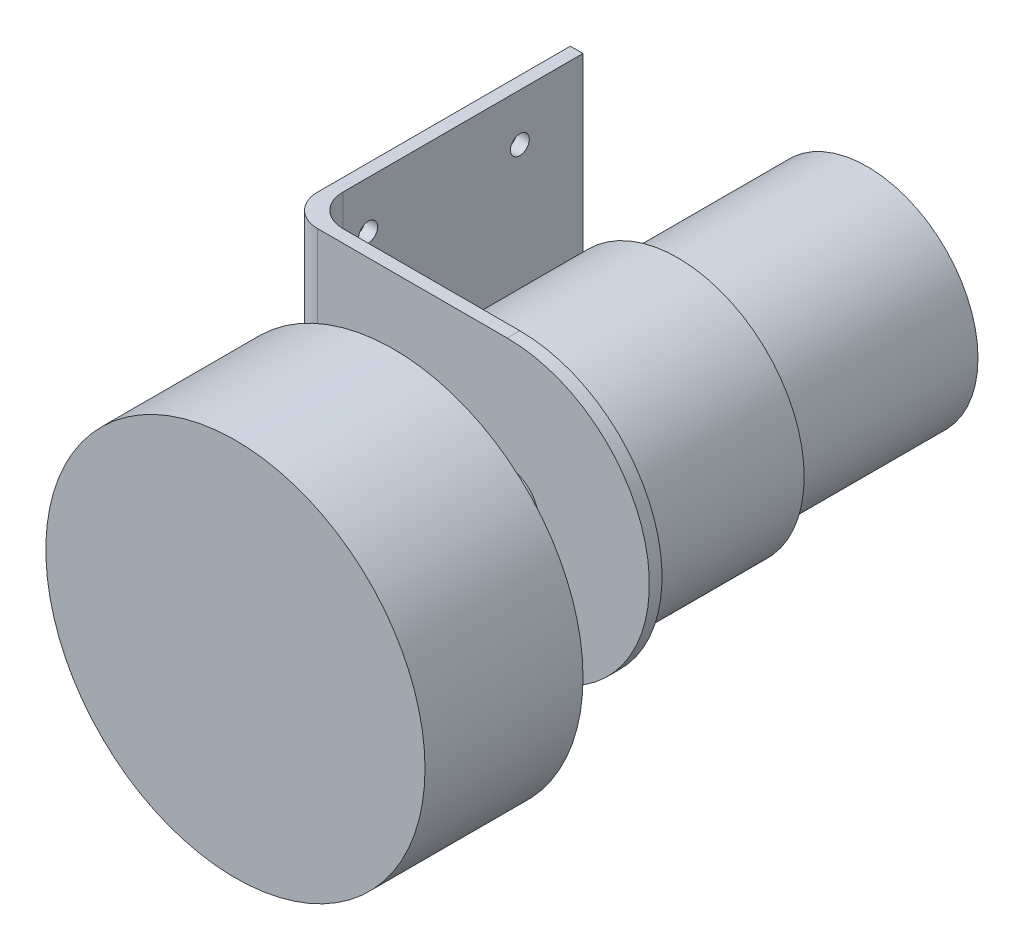
ISO-10303-21;
HEADER;
FILE_DESCRIPTION(('STEP AP214'),'2;1');
FILE_NAME('part.step','',(''),(''),'','','');
FILE_SCHEMA(('AUTOMOTIVE_DESIGN { 1 0 10303 214 1 1 1 1 }'));
ENDSEC;
DATA;
#1=APPLICATION_CONTEXT('core data for automotive mechanical design processes');
#2=APPLICATION_PROTOCOL_DEFINITION('international standard','automotive_design',2000,#1);
#3=PRODUCT_CONTEXT('',#1,'mechanical');
#4=PRODUCT('Part','Part','',(#3));
#5=PRODUCT_RELATED_PRODUCT_CATEGORY('part','',(#4));
#6=PRODUCT_DEFINITION_FORMATION('','',#4);
#7=PRODUCT_DEFINITION_CONTEXT('part definition',#1,'design');
#8=PRODUCT_DEFINITION('design','',#6,#7);
#9=PRODUCT_DEFINITION_SHAPE('','',#8);
#10=(LENGTH_UNIT() NAMED_UNIT(*) SI_UNIT(.MILLI.,.METRE.));
#11=(NAMED_UNIT(*) PLANE_ANGLE_UNIT() SI_UNIT($,.RADIAN.));
#12=(NAMED_UNIT(*) SI_UNIT($,.STERADIAN.) SOLID_ANGLE_UNIT());
#13=UNCERTAINTY_MEASURE_WITH_UNIT(LENGTH_MEASURE(1.E-05),#10,'distance_accuracy_value','');
#14=(GEOMETRIC_REPRESENTATION_CONTEXT(3) GLOBAL_UNCERTAINTY_ASSIGNED_CONTEXT((#13)) GLOBAL_UNIT_ASSIGNED_CONTEXT((#10,
#11,#12)) REPRESENTATION_CONTEXT('',''));
#15=CARTESIAN_POINT('',(0.,0.,0.));
#16=DIRECTION('',(0.,0.,1.));
#17=DIRECTION('',(1.,0.,0.));
#18=AXIS2_PLACEMENT_3D('',#15,#16,#17);
#19=CARTESIAN_POINT('',(0.,0.,100.));
#20=DIRECTION('',(0.,0.,-1.));
#21=DIRECTION('',(-1.,0.,0.));
#22=AXIS2_PLACEMENT_3D('',#19,#20,#21);
#23=CYLINDRICAL_SURFACE('',#22,5.);
#24=CARTESIAN_POINT('',(0.,0.,57.));
#25=DIRECTION('',(0.,0.,1.));
#26=DIRECTION('',(1.,0.,0.));
#27=AXIS2_PLACEMENT_3D('',#24,#25,#26);
#28=CIRCLE('',#27,5.);
#29=CARTESIAN_POINT('',(5.,0.,57.));
#30=VERTEX_POINT('',#29);
#31=EDGE_CURVE('E174',#30,#30,#28,.F.);
#32=ORIENTED_EDGE('',*,*,#31,.F.);
#33=EDGE_LOOP('',(#32));
#34=FACE_BOUND('',#33,.T.);
#35=CARTESIAN_POINT('',(0.,0.,75.));
#36=DIRECTION('',(0.,0.,1.));
#37=DIRECTION('',(1.,0.,0.));
#38=AXIS2_PLACEMENT_3D('',#35,#36,#37);
#39=CIRCLE('',#38,5.);
#40=CARTESIAN_POINT('',(5.,0.,75.));
#41=VERTEX_POINT('',#40);
#42=EDGE_CURVE('E161',#41,#41,#39,.F.);
#43=ORIENTED_EDGE('',*,*,#42,.T.);
#44=EDGE_LOOP('',(#43));
#45=FACE_BOUND('',#44,.T.);
#46=ADVANCED_FACE('F35',(#34,#45),#23,.T.);
#47=CARTESIAN_POINT('',(0.,0.,75.));
#48=DIRECTION('',(0.,0.,1.));
#49=DIRECTION('',(1.,0.,0.));
#50=AXIS2_PLACEMENT_3D('',#47,#48,#49);
#51=CYLINDRICAL_SURFACE('',#50,30.);
#52=CARTESIAN_POINT('',(0.,0.,75.));
#53=DIRECTION('',(0.,0.,1.));
#54=DIRECTION('',(1.,0.,0.));
#55=AXIS2_PLACEMENT_3D('',#52,#53,#54);
#56=CIRCLE('',#55,30.);
#57=CARTESIAN_POINT('',(30.,0.,75.));
#58=VERTEX_POINT('',#57);
#59=EDGE_CURVE('E158',#58,#58,#56,.T.);
#60=ORIENTED_EDGE('',*,*,#59,.T.);
#61=EDGE_LOOP('',(#60));
#62=FACE_BOUND('',#61,.T.);
#63=CARTESIAN_POINT('',(0.,0.,100.));
#64=DIRECTION('',(0.,0.,1.));
#65=DIRECTION('',(1.,0.,0.));
#66=AXIS2_PLACEMENT_3D('',#63,#64,#65);
#67=CIRCLE('',#66,30.);
#68=CARTESIAN_POINT('',(30.,0.,100.));
#69=VERTEX_POINT('',#68);
#70=EDGE_CURVE('E157',#69,#69,#67,.T.);
#71=ORIENTED_EDGE('',*,*,#70,.F.);
#72=EDGE_LOOP('',(#71));
#73=FACE_BOUND('',#72,.T.);
#74=ADVANCED_FACE('F225',(#62,#73),#51,.T.);
#75=CARTESIAN_POINT('',(0.,0.,75.));
#76=DIRECTION('',(0.,0.,1.));
#77=DIRECTION('',(1.,0.,0.));
#78=AXIS2_PLACEMENT_3D('',#75,#76,#77);
#79=PLANE('',#78);
#80=ORIENTED_EDGE('',*,*,#42,.F.);
#81=EDGE_LOOP('',(#80));
#82=FACE_BOUND('',#81,.T.);
#83=ORIENTED_EDGE('',*,*,#59,.F.);
#84=EDGE_LOOP('',(#83));
#85=FACE_BOUND('',#84,.T.);
#86=ADVANCED_FACE('F231',(#82,#85),#79,.F.);
#87=CARTESIAN_POINT('',(0.,0.,100.));
#88=DIRECTION('',(0.,0.,-1.));
#89=DIRECTION('',(-1.,0.,0.));
#90=AXIS2_PLACEMENT_3D('',#87,#88,#89);
#91=PLANE('',#90);
#92=ORIENTED_EDGE('',*,*,#70,.T.);
#93=EDGE_LOOP('',(#92));
#94=FACE_BOUND('',#93,.T.);
#95=ADVANCED_FACE('F238',(#94),#91,.F.);
#96=CARTESIAN_POINT('',(0.,0.,57.));
#97=DIRECTION('',(0.,0.,-1.));
#98=DIRECTION('',(-1.,0.,0.));
#99=AXIS2_PLACEMENT_3D('',#96,#97,#98);
#100=CYLINDRICAL_SURFACE('',#99,22.5);
#101=CARTESIAN_POINT('',(0.,0.,55.));
#102=DIRECTION('',(0.,0.,1.));
#103=DIRECTION('',(1.,0.,0.));
#104=AXIS2_PLACEMENT_3D('',#101,#102,#103);
#105=CIRCLE('',#104,22.5);
#106=CARTESIAN_POINT('',(0.,-22.5,55.));
#107=VERTEX_POINT('',#106);
#108=CARTESIAN_POINT('',(0.,22.5,55.));
#109=VERTEX_POINT('',#108);
#110=EDGE_CURVE('E134',#107,#109,#105,.T.);
#111=ORIENTED_EDGE('',*,*,#110,.T.);
#112=DIRECTION('',(0.,0.,-1.));
#113=VECTOR('',#112,1.);
#114=CARTESIAN_POINT('',(0.,22.5,57.));
#115=LINE('',#114,#113);
#116=CARTESIAN_POINT('',(0.,22.5,57.));
#117=VERTEX_POINT('',#116);
#118=EDGE_CURVE('E154',#117,#109,#115,.T.);
#119=ORIENTED_EDGE('',*,*,#118,.F.);
#120=CARTESIAN_POINT('',(0.,0.,57.));
#121=DIRECTION('',(0.,0.,1.));
#122=DIRECTION('',(1.,0.,0.));
#123=AXIS2_PLACEMENT_3D('',#120,#121,#122);
#124=CIRCLE('',#123,22.5);
#125=CARTESIAN_POINT('',(0.,-22.5,57.));
#126=VERTEX_POINT('',#125);
#127=EDGE_CURVE('E136',#126,#117,#124,.T.);
#128=ORIENTED_EDGE('',*,*,#127,.F.);
#129=DIRECTION('',(0.,0.,-1.));
#130=VECTOR('',#129,1.);
#131=CARTESIAN_POINT('',(0.,-22.5,57.));
#132=LINE('',#131,#130);
#133=EDGE_CURVE('E106',#126,#107,#132,.T.);
#134=ORIENTED_EDGE('',*,*,#133,.T.);
#135=EDGE_LOOP('',(#111,#119,#128,#134));
#136=FACE_BOUND('',#135,.T.);
#137=ADVANCED_FACE('F219',(#136),#100,.T.);
#138=CARTESIAN_POINT('',(0.,22.5,57.));
#139=DIRECTION('',(0.,-1.,0.));
#140=DIRECTION('',(0.,0.,-1.));
#141=AXIS2_PLACEMENT_3D('',#138,#139,#140);
#142=PLANE('',#141);
#143=DIRECTION('',(0.,0.,-1.));
#144=VECTOR('',#143,1.);
#145=CARTESIAN_POINT('',(-35.,22.5,57.));
#146=LINE('',#145,#144);
#147=CARTESIAN_POINT('',(-35.,22.5,52.));
#148=VERTEX_POINT('',#147);
#149=CARTESIAN_POINT('',(-35.,22.5,12.));
#150=VERTEX_POINT('',#149);
#151=EDGE_CURVE('E105',#148,#150,#146,.T.);
#152=ORIENTED_EDGE('',*,*,#151,.F.);
#153=CARTESIAN_POINT('',(-30.,22.5,52.));
#154=DIRECTION('',(0.,-1.,0.));
#155=DIRECTION('',(0.,0.,-1.));
#156=AXIS2_PLACEMENT_3D('',#153,#154,#155);
#157=CIRCLE('',#156,5.);
#158=CARTESIAN_POINT('',(-30.,22.5,57.));
#159=VERTEX_POINT('',#158);
#160=EDGE_CURVE('E191',#148,#159,#157,.F.);
#161=ORIENTED_EDGE('',*,*,#160,.T.);
#162=DIRECTION('',(-1.,0.,0.));
#163=VECTOR('',#162,1.);
#164=CARTESIAN_POINT('',(0.,22.5,57.));
#165=LINE('',#164,#163);
#166=EDGE_CURVE('E139',#117,#159,#165,.T.);
#167=ORIENTED_EDGE('',*,*,#166,.F.);
#168=ORIENTED_EDGE('',*,*,#118,.T.);
#169=DIRECTION('',(-1.,0.,0.));
#170=VECTOR('',#169,1.);
#171=CARTESIAN_POINT('',(0.,22.5,55.));
#172=LINE('',#171,#170);
#173=CARTESIAN_POINT('',(-28.,22.5,55.));
#174=VERTEX_POINT('',#173);
#175=EDGE_CURVE('E147',#109,#174,#172,.T.);
#176=ORIENTED_EDGE('',*,*,#175,.T.);
#177=CARTESIAN_POINT('',(-28.,22.5,50.));
#178=DIRECTION('',(0.,-1.,0.));
#179=DIRECTION('',(0.,0.,-1.));
#180=AXIS2_PLACEMENT_3D('',#177,#178,#179);
#181=CIRCLE('',#180,5.);
#182=CARTESIAN_POINT('',(-33.,22.5,50.));
#183=VERTEX_POINT('',#182);
#184=EDGE_CURVE('E44',#174,#183,#181,.T.);
#185=ORIENTED_EDGE('',*,*,#184,.T.);
#186=DIRECTION('',(0.,0.,1.));
#187=VECTOR('',#186,1.);
#188=CARTESIAN_POINT('',(-33.,22.5,12.));
#189=LINE('',#188,#187);
#190=CARTESIAN_POINT('',(-33.,22.5,12.));
#191=VERTEX_POINT('',#190);
#192=EDGE_CURVE('E131',#191,#183,#189,.T.);
#193=ORIENTED_EDGE('',*,*,#192,.F.);
#194=DIRECTION('',(-1.,0.,0.));
#195=VECTOR('',#194,1.);
#196=CARTESIAN_POINT('',(-35.,22.5,12.));
#197=LINE('',#196,#195);
#198=EDGE_CURVE('E128',#191,#150,#197,.T.);
#199=ORIENTED_EDGE('',*,*,#198,.T.);
#200=EDGE_LOOP('',(#152,#161,#167,#168,#176,#185,#193,#199));
#201=FACE_BOUND('',#200,.T.);
#202=ADVANCED_FACE('F210',(#201),#142,.F.);
#203=CARTESIAN_POINT('',(-35.,22.5,57.));
#204=DIRECTION('',(1.,0.,0.));
#205=DIRECTION('',(0.,0.,-1.));
#206=AXIS2_PLACEMENT_3D('',#203,#204,#205);
#207=PLANE('',#206);
#208=CARTESIAN_POINT('',(-35.,-15.,22.));
#209=DIRECTION('',(-1.,0.,0.));
#210=DIRECTION('',(0.,0.,-1.));
#211=AXIS2_PLACEMENT_3D('',#208,#209,#210);
#212=CIRCLE('',#211,1.5);
#213=CARTESIAN_POINT('',(-35.,-15.,23.5));
#214=VERTEX_POINT('',#213);
#215=EDGE_CURVE('E197',#214,#214,#212,.T.);
#216=ORIENTED_EDGE('',*,*,#215,.F.);
#217=EDGE_LOOP('',(#216));
#218=FACE_BOUND('',#217,.T.);
#219=CARTESIAN_POINT('',(-35.,15.,46.));
#220=DIRECTION('',(-1.,0.,0.));
#221=DIRECTION('',(0.,0.,1.));
#222=AXIS2_PLACEMENT_3D('',#219,#220,#221);
#223=CIRCLE('',#222,1.5);
#224=CARTESIAN_POINT('',(-35.,15.,47.5));
#225=VERTEX_POINT('',#224);
#226=EDGE_CURVE('E440',#225,#225,#223,.T.);
#227=ORIENTED_EDGE('',*,*,#226,.F.);
#228=EDGE_LOOP('',(#227));
#229=FACE_BOUND('',#228,.T.);
#230=CARTESIAN_POINT('',(-35.,-15.,46.));
#231=DIRECTION('',(-1.,0.,0.));
#232=DIRECTION('',(0.,0.,-1.));
#233=AXIS2_PLACEMENT_3D('',#230,#231,#232);
#234=CIRCLE('',#233,1.5);
#235=CARTESIAN_POINT('',(-35.,-15.,47.5));
#236=VERTEX_POINT('',#235);
#237=EDGE_CURVE('E443',#236,#236,#234,.T.);
#238=ORIENTED_EDGE('',*,*,#237,.F.);
#239=EDGE_LOOP('',(#238));
#240=FACE_BOUND('',#239,.T.);
#241=CARTESIAN_POINT('',(-35.,15.,22.));
#242=DIRECTION('',(-1.,0.,0.));
#243=DIRECTION('',(0.,0.,1.));
#244=AXIS2_PLACEMENT_3D('',#241,#242,#243);
#245=CIRCLE('',#244,1.5);
#246=CARTESIAN_POINT('',(-35.,15.,23.5));
#247=VERTEX_POINT('',#246);
#248=EDGE_CURVE('E122',#247,#247,#245,.T.);
#249=ORIENTED_EDGE('',*,*,#248,.F.);
#250=EDGE_LOOP('',(#249));
#251=FACE_BOUND('',#250,.T.);
#252=DIRECTION('',(0.,0.,-1.));
#253=VECTOR('',#252,1.);
#254=CARTESIAN_POINT('',(-35.,-22.5,57.));
#255=LINE('',#254,#253);
#256=CARTESIAN_POINT('',(-35.,-22.5,52.));
#257=VERTEX_POINT('',#256);
#258=CARTESIAN_POINT('',(-35.,-22.5,12.));
#259=VERTEX_POINT('',#258);
#260=EDGE_CURVE('E99',#257,#259,#255,.T.);
#261=ORIENTED_EDGE('',*,*,#260,.F.);
#262=DIRECTION('',(0.,-1.,0.));
#263=VECTOR('',#262,1.);
#264=CARTESIAN_POINT('',(-35.,22.5,52.));
#265=LINE('',#264,#263);
#266=EDGE_CURVE('E52',#257,#148,#265,.F.);
#267=ORIENTED_EDGE('',*,*,#266,.T.);
#268=ORIENTED_EDGE('',*,*,#151,.T.);
#269=DIRECTION('',(0.,-1.,0.));
#270=VECTOR('',#269,1.);
#271=CARTESIAN_POINT('',(-35.,-22.5,12.));
#272=LINE('',#271,#270);
#273=EDGE_CURVE('E113',#150,#259,#272,.T.);
#274=ORIENTED_EDGE('',*,*,#273,.T.);
#275=EDGE_LOOP('',(#261,#267,#268,#274));
#276=FACE_BOUND('',#275,.T.);
#277=ADVANCED_FACE('F118',(#218,#229,#240,#251,#276),#207,.F.);
#278=CARTESIAN_POINT('',(-35.,-22.5,57.));
#279=DIRECTION('',(0.,1.,0.));
#280=DIRECTION('',(0.,0.,1.));
#281=AXIS2_PLACEMENT_3D('',#278,#279,#280);
#282=PLANE('',#281);
#283=DIRECTION('',(1.,0.,0.));
#284=VECTOR('',#283,1.);
#285=CARTESIAN_POINT('',(-35.,-22.5,57.));
#286=LINE('',#285,#284);
#287=CARTESIAN_POINT('',(-30.,-22.5,57.));
#288=VERTEX_POINT('',#287);
#289=EDGE_CURVE('E143',#288,#126,#286,.T.);
#290=ORIENTED_EDGE('',*,*,#289,.F.);
#291=CARTESIAN_POINT('',(-30.,-22.5,52.));
#292=DIRECTION('',(0.,1.,0.));
#293=DIRECTION('',(0.,0.,1.));
#294=AXIS2_PLACEMENT_3D('',#291,#292,#293);
#295=CIRCLE('',#294,5.);
#296=EDGE_CURVE('E60',#288,#257,#295,.F.);
#297=ORIENTED_EDGE('',*,*,#296,.T.);
#298=ORIENTED_EDGE('',*,*,#260,.T.);
#299=DIRECTION('',(1.,0.,0.));
#300=VECTOR('',#299,1.);
#301=CARTESIAN_POINT('',(-33.,-22.5,12.));
#302=LINE('',#301,#300);
#303=CARTESIAN_POINT('',(-33.,-22.5,12.));
#304=VERTEX_POINT('',#303);
#305=EDGE_CURVE('E103',#259,#304,#302,.T.);
#306=ORIENTED_EDGE('',*,*,#305,.T.);
#307=DIRECTION('',(0.,0.,1.));
#308=VECTOR('',#307,1.);
#309=CARTESIAN_POINT('',(-33.,-22.5,12.));
#310=LINE('',#309,#308);
#311=CARTESIAN_POINT('',(-33.,-22.5,50.));
#312=VERTEX_POINT('',#311);
#313=EDGE_CURVE('E130',#304,#312,#310,.T.);
#314=ORIENTED_EDGE('',*,*,#313,.T.);
#315=CARTESIAN_POINT('',(-28.,-22.5,50.));
#316=DIRECTION('',(0.,1.,0.));
#317=DIRECTION('',(0.,0.,1.));
#318=AXIS2_PLACEMENT_3D('',#315,#316,#317);
#319=CIRCLE('',#318,5.);
#320=CARTESIAN_POINT('',(-28.,-22.5,55.));
#321=VERTEX_POINT('',#320);
#322=EDGE_CURVE('E11',#312,#321,#319,.T.);
#323=ORIENTED_EDGE('',*,*,#322,.T.);
#324=DIRECTION('',(1.,0.,0.));
#325=VECTOR('',#324,1.);
#326=CARTESIAN_POINT('',(-35.,-22.5,55.));
#327=LINE('',#326,#325);
#328=EDGE_CURVE('E140',#321,#107,#327,.T.);
#329=ORIENTED_EDGE('',*,*,#328,.T.);
#330=ORIENTED_EDGE('',*,*,#133,.F.);
#331=EDGE_LOOP('',(#290,#297,#298,#306,#314,#323,#329,#330));
#332=FACE_BOUND('',#331,.T.);
#333=ADVANCED_FACE('F101',(#332),#282,.F.);
#334=CARTESIAN_POINT('',(0.,0.,57.));
#335=DIRECTION('',(0.,0.,1.));
#336=DIRECTION('',(1.,0.,0.));
#337=AXIS2_PLACEMENT_3D('',#334,#335,#336);
#338=PLANE('',#337);
#339=ORIENTED_EDGE('',*,*,#166,.T.);
#340=DIRECTION('',(0.,-1.,0.));
#341=VECTOR('',#340,1.);
#342=CARTESIAN_POINT('',(-30.,-22.5,57.));
#343=LINE('',#342,#341);
#344=EDGE_CURVE('E186',#159,#288,#343,.T.);
#345=ORIENTED_EDGE('',*,*,#344,.T.);
#346=ORIENTED_EDGE('',*,*,#289,.T.);
#347=ORIENTED_EDGE('',*,*,#127,.T.);
#348=EDGE_LOOP('',(#339,#345,#346,#347));
#349=FACE_BOUND('',#348,.T.);
#350=ORIENTED_EDGE('',*,*,#31,.T.);
#351=EDGE_LOOP('',(#350));
#352=FACE_BOUND('',#351,.T.);
#353=ADVANCED_FACE('F217',(#349,#352),#338,.T.);
#354=CARTESIAN_POINT('',(0.,0.,55.));
#355=DIRECTION('',(0.,0.,1.));
#356=DIRECTION('',(1.,0.,0.));
#357=AXIS2_PLACEMENT_3D('',#354,#355,#356);
#358=PLANE('',#357);
#359=CARTESIAN_POINT('',(0.,0.,55.));
#360=DIRECTION('',(0.,0.,1.));
#361=DIRECTION('',(1.,0.,0.));
#362=AXIS2_PLACEMENT_3D('',#359,#360,#361);
#363=CIRCLE('',#362,20.);
#364=CARTESIAN_POINT('',(20.,0.,55.));
#365=VERTEX_POINT('',#364);
#366=EDGE_CURVE('E164',#365,#365,#363,.T.);
#367=ORIENTED_EDGE('',*,*,#366,.T.);
#368=EDGE_LOOP('',(#367));
#369=FACE_BOUND('',#368,.T.);
#370=ORIENTED_EDGE('',*,*,#328,.F.);
#371=DIRECTION('',(0.,1.,0.));
#372=VECTOR('',#371,1.);
#373=CARTESIAN_POINT('',(-28.,0.,55.));
#374=LINE('',#373,#372);
#375=EDGE_CURVE('E181',#321,#174,#374,.T.);
#376=ORIENTED_EDGE('',*,*,#375,.T.);
#377=ORIENTED_EDGE('',*,*,#175,.F.);
#378=ORIENTED_EDGE('',*,*,#110,.F.);
#379=EDGE_LOOP('',(#370,#376,#377,#378));
#380=FACE_BOUND('',#379,.T.);
#381=ADVANCED_FACE('F252',(#369,#380),#358,.F.);
#382=CARTESIAN_POINT('',(0.,0.,0.));
#383=DIRECTION('',(0.,0.,1.));
#384=DIRECTION('',(1.,0.,0.));
#385=AXIS2_PLACEMENT_3D('',#382,#383,#384);
#386=PLANE('',#385);
#387=CARTESIAN_POINT('',(0.,0.,0.));
#388=DIRECTION('',(0.,0.,1.));
#389=DIRECTION('',(1.,0.,0.));
#390=AXIS2_PLACEMENT_3D('',#387,#388,#389);
#391=CIRCLE('',#390,17.5);
#392=CARTESIAN_POINT('',(17.5,0.,0.));
#393=VERTEX_POINT('',#392);
#394=EDGE_CURVE('E167',#393,#393,#391,.T.);
#395=ORIENTED_EDGE('',*,*,#394,.F.);
#396=EDGE_LOOP('',(#395));
#397=FACE_BOUND('',#396,.T.);
#398=ADVANCED_FACE('F249',(#397),#386,.F.);
#399=CARTESIAN_POINT('',(0.,0.,30.));
#400=DIRECTION('',(0.,0.,-1.));
#401=DIRECTION('',(-1.,0.,0.));
#402=AXIS2_PLACEMENT_3D('',#399,#400,#401);
#403=CYLINDRICAL_SURFACE('',#402,17.5);
#404=CARTESIAN_POINT('',(0.,0.,30.));
#405=DIRECTION('',(0.,0.,1.));
#406=DIRECTION('',(1.,0.,0.));
#407=AXIS2_PLACEMENT_3D('',#404,#405,#406);
#408=CIRCLE('',#407,17.5);
#409=CARTESIAN_POINT('',(17.5,0.,30.));
#410=VERTEX_POINT('',#409);
#411=EDGE_CURVE('E171',#410,#410,#408,.T.);
#412=ORIENTED_EDGE('',*,*,#411,.F.);
#413=EDGE_LOOP('',(#412));
#414=FACE_BOUND('',#413,.T.);
#415=ORIENTED_EDGE('',*,*,#394,.T.);
#416=EDGE_LOOP('',(#415));
#417=FACE_BOUND('',#416,.T.);
#418=ADVANCED_FACE('F243',(#414,#417),#403,.T.);
#419=CARTESIAN_POINT('',(0.,0.,30.));
#420=DIRECTION('',(0.,0.,1.));
#421=DIRECTION('',(1.,0.,0.));
#422=AXIS2_PLACEMENT_3D('',#419,#420,#421);
#423=PLANE('',#422);
#424=ORIENTED_EDGE('',*,*,#411,.T.);
#425=EDGE_LOOP('',(#424));
#426=FACE_BOUND('',#425,.T.);
#427=CARTESIAN_POINT('',(0.,0.,30.));
#428=DIRECTION('',(0.,0.,1.));
#429=DIRECTION('',(1.,0.,0.));
#430=AXIS2_PLACEMENT_3D('',#427,#428,#429);
#431=CIRCLE('',#430,20.);
#432=CARTESIAN_POINT('',(20.,0.,30.));
#433=VERTEX_POINT('',#432);
#434=EDGE_CURVE('E168',#433,#433,#431,.T.);
#435=ORIENTED_EDGE('',*,*,#434,.F.);
#436=EDGE_LOOP('',(#435));
#437=FACE_BOUND('',#436,.T.);
#438=ADVANCED_FACE('F239',(#426,#437),#423,.F.);
#439=CARTESIAN_POINT('',(0.,0.,55.));
#440=DIRECTION('',(0.,0.,-1.));
#441=DIRECTION('',(-1.,0.,0.));
#442=AXIS2_PLACEMENT_3D('',#439,#440,#441);
#443=CYLINDRICAL_SURFACE('',#442,20.);
#444=ORIENTED_EDGE('',*,*,#366,.F.);
#445=EDGE_LOOP('',(#444));
#446=FACE_BOUND('',#445,.T.);
#447=ORIENTED_EDGE('',*,*,#434,.T.);
#448=EDGE_LOOP('',(#447));
#449=FACE_BOUND('',#448,.T.);
#450=ADVANCED_FACE('F242',(#446,#449),#443,.T.);
#451=CARTESIAN_POINT('',(-33.,22.5,12.));
#452=DIRECTION('',(1.,0.,0.));
#453=DIRECTION('',(0.,1.,0.));
#454=AXIS2_PLACEMENT_3D('',#451,#452,#453);
#455=PLANE('',#454);
#456=CARTESIAN_POINT('',(-33.,-15.,22.));
#457=DIRECTION('',(1.,0.,0.));
#458=DIRECTION('',(0.,1.,0.));
#459=AXIS2_PLACEMENT_3D('',#456,#457,#458);
#460=CIRCLE('',#459,1.5);
#461=CARTESIAN_POINT('',(-33.,-15.,23.5));
#462=VERTEX_POINT('',#461);
#463=EDGE_CURVE('E39',#462,#462,#460,.T.);
#464=ORIENTED_EDGE('',*,*,#463,.F.);
#465=EDGE_LOOP('',(#464));
#466=FACE_BOUND('',#465,.T.);
#467=CARTESIAN_POINT('',(-33.,15.,46.));
#468=DIRECTION('',(1.,0.,0.));
#469=DIRECTION('',(0.,1.,0.));
#470=AXIS2_PLACEMENT_3D('',#467,#468,#469);
#471=CIRCLE('',#470,1.5);
#472=CARTESIAN_POINT('',(-33.,15.,47.5));
#473=VERTEX_POINT('',#472);
#474=EDGE_CURVE('E196',#473,#473,#471,.T.);
#475=ORIENTED_EDGE('',*,*,#474,.F.);
#476=EDGE_LOOP('',(#475));
#477=FACE_BOUND('',#476,.T.);
#478=CARTESIAN_POINT('',(-33.,-15.,46.));
#479=DIRECTION('',(1.,0.,0.));
#480=DIRECTION('',(0.,1.,0.));
#481=AXIS2_PLACEMENT_3D('',#478,#479,#480);
#482=CIRCLE('',#481,1.5);
#483=CARTESIAN_POINT('',(-33.,-15.,47.5));
#484=VERTEX_POINT('',#483);
#485=EDGE_CURVE('E194',#484,#484,#482,.T.);
#486=ORIENTED_EDGE('',*,*,#485,.F.);
#487=EDGE_LOOP('',(#486));
#488=FACE_BOUND('',#487,.T.);
#489=CARTESIAN_POINT('',(-33.,15.,22.));
#490=DIRECTION('',(1.,0.,0.));
#491=DIRECTION('',(0.,1.,0.));
#492=AXIS2_PLACEMENT_3D('',#489,#490,#491);
#493=CIRCLE('',#492,1.5);
#494=CARTESIAN_POINT('',(-33.,15.,23.5));
#495=VERTEX_POINT('',#494);
#496=EDGE_CURVE('E119',#495,#495,#493,.T.);
#497=ORIENTED_EDGE('',*,*,#496,.F.);
#498=EDGE_LOOP('',(#497));
#499=FACE_BOUND('',#498,.T.);
#500=ORIENTED_EDGE('',*,*,#192,.T.);
#501=DIRECTION('',(0.,1.,0.));
#502=VECTOR('',#501,1.);
#503=CARTESIAN_POINT('',(-33.,22.5,50.));
#504=LINE('',#503,#502);
#505=EDGE_CURVE('E184',#183,#312,#504,.F.);
#506=ORIENTED_EDGE('',*,*,#505,.T.);
#507=ORIENTED_EDGE('',*,*,#313,.F.);
#508=DIRECTION('',(0.,1.,0.));
#509=VECTOR('',#508,1.);
#510=CARTESIAN_POINT('',(-33.,22.5,12.));
#511=LINE('',#510,#509);
#512=EDGE_CURVE('E116',#304,#191,#511,.T.);
#513=ORIENTED_EDGE('',*,*,#512,.T.);
#514=EDGE_LOOP('',(#500,#506,#507,#513));
#515=FACE_BOUND('',#514,.T.);
#516=ADVANCED_FACE('F247',(#466,#477,#488,#499,#515),#455,.T.);
#517=CARTESIAN_POINT('',(0.,0.,12.));
#518=DIRECTION('',(0.,0.,-1.));
#519=DIRECTION('',(-1.,0.,0.));
#520=AXIS2_PLACEMENT_3D('',#517,#518,#519);
#521=PLANE('',#520);
#522=ORIENTED_EDGE('',*,*,#273,.F.);
#523=ORIENTED_EDGE('',*,*,#198,.F.);
#524=ORIENTED_EDGE('',*,*,#512,.F.);
#525=ORIENTED_EDGE('',*,*,#305,.F.);
#526=EDGE_LOOP('',(#522,#523,#524,#525));
#527=FACE_BOUND('',#526,.T.);
#528=ADVANCED_FACE('F111',(#527),#521,.T.);
#529=CARTESIAN_POINT('',(-28.,0.,50.));
#530=DIRECTION('',(0.,1.,0.));
#531=DIRECTION('',(-1.,0.,0.));
#532=AXIS2_PLACEMENT_3D('',#529,#530,#531);
#533=CYLINDRICAL_SURFACE('',#532,5.);
#534=ORIENTED_EDGE('',*,*,#322,.F.);
#535=ORIENTED_EDGE('',*,*,#505,.F.);
#536=ORIENTED_EDGE('',*,*,#184,.F.);
#537=ORIENTED_EDGE('',*,*,#375,.F.);
#538=EDGE_LOOP('',(#534,#535,#536,#537));
#539=FACE_BOUND('',#538,.T.);
#540=ADVANCED_FACE('F256',(#539),#533,.F.);
#541=CARTESIAN_POINT('',(-30.,0.,52.));
#542=DIRECTION('',(0.,1.,0.));
#543=DIRECTION('',(0.,0.,1.));
#544=AXIS2_PLACEMENT_3D('',#541,#542,#543);
#545=CYLINDRICAL_SURFACE('',#544,5.);
#546=ORIENTED_EDGE('',*,*,#160,.F.);
#547=ORIENTED_EDGE('',*,*,#266,.F.);
#548=ORIENTED_EDGE('',*,*,#296,.F.);
#549=ORIENTED_EDGE('',*,*,#344,.F.);
#550=EDGE_LOOP('',(#546,#547,#548,#549));
#551=FACE_BOUND('',#550,.T.);
#552=ADVANCED_FACE('F37',(#551),#545,.T.);
#553=CARTESIAN_POINT('',(-30.,15.,22.));
#554=DIRECTION('',(-1.,0.,0.));
#555=DIRECTION('',(0.,0.,1.));
#556=AXIS2_PLACEMENT_3D('',#553,#554,#555);
#557=CYLINDRICAL_SURFACE('',#556,1.5);
#558=CARTESIAN_POINT('',(-33.,15.,23.5));
#559=CARTESIAN_POINT('',(-33.0208333333333,15.,23.5));
#560=CARTESIAN_POINT('',(-33.0416666666667,15.,23.5));
#561=CARTESIAN_POINT('',(-33.0833333333333,15.,23.5));
#562=CARTESIAN_POINT('',(-33.1041666666667,15.,23.5));
#563=CARTESIAN_POINT('',(-33.1458333333333,15.,23.5));
#564=CARTESIAN_POINT('',(-33.1666666666667,15.,23.5));
#565=CARTESIAN_POINT('',(-33.2083333333333,15.,23.5));
#566=CARTESIAN_POINT('',(-33.2291666666667,15.,23.5));
#567=CARTESIAN_POINT('',(-33.2708333333333,15.,23.5));
#568=CARTESIAN_POINT('',(-33.2916666666667,15.,23.5));
#569=CARTESIAN_POINT('',(-33.3333333333333,15.,23.5));
#570=CARTESIAN_POINT('',(-33.3541666666667,15.,23.5));
#571=CARTESIAN_POINT('',(-33.3958333333333,15.,23.5));
#572=CARTESIAN_POINT('',(-33.4166666666667,15.,23.5));
#573=CARTESIAN_POINT('',(-33.4583333333333,15.,23.5));
#574=CARTESIAN_POINT('',(-33.4791666666667,15.,23.5));
#575=CARTESIAN_POINT('',(-33.5208333333333,15.,23.5));
#576=CARTESIAN_POINT('',(-33.5416666666667,15.,23.5));
#577=CARTESIAN_POINT('',(-33.5833333333333,15.,23.5));
#578=CARTESIAN_POINT('',(-33.6041666666667,15.,23.5));
#579=CARTESIAN_POINT('',(-33.6458333333333,15.,23.5));
#580=CARTESIAN_POINT('',(-33.6666666666667,15.,23.5));
#581=CARTESIAN_POINT('',(-33.7083333333333,15.,23.5));
#582=CARTESIAN_POINT('',(-33.7291666666667,15.,23.5));
#583=CARTESIAN_POINT('',(-33.7708333333333,15.,23.5));
#584=CARTESIAN_POINT('',(-33.7916666666667,15.,23.5));
#585=CARTESIAN_POINT('',(-33.8333333333333,15.,23.5));
#586=CARTESIAN_POINT('',(-33.8541666666667,15.,23.5));
#587=CARTESIAN_POINT('',(-33.8958333333333,15.,23.5));
#588=CARTESIAN_POINT('',(-33.9166666666667,15.,23.5));
#589=CARTESIAN_POINT('',(-33.9583333333333,15.,23.5));
#590=CARTESIAN_POINT('',(-33.9791666666667,15.,23.5));
#591=CARTESIAN_POINT('',(-34.0208333333333,15.,23.5));
#592=CARTESIAN_POINT('',(-34.0416666666667,15.,23.5));
#593=CARTESIAN_POINT('',(-34.0833333333333,15.,23.5));
#594=CARTESIAN_POINT('',(-34.1041666666667,15.,23.5));
#595=CARTESIAN_POINT('',(-34.1458333333333,15.,23.5));
#596=CARTESIAN_POINT('',(-34.1666666666667,15.,23.5));
#597=CARTESIAN_POINT('',(-34.2083333333333,15.,23.5));
#598=CARTESIAN_POINT('',(-34.2291666666667,15.,23.5));
#599=CARTESIAN_POINT('',(-34.2708333333333,15.,23.5));
#600=CARTESIAN_POINT('',(-34.2916666666667,15.,23.5));
#601=CARTESIAN_POINT('',(-34.3333333333333,15.,23.5));
#602=CARTESIAN_POINT('',(-34.3541666666667,15.,23.5));
#603=CARTESIAN_POINT('',(-34.3958333333333,15.,23.5));
#604=CARTESIAN_POINT('',(-34.4166666666667,15.,23.5));
#605=CARTESIAN_POINT('',(-34.4583333333333,15.,23.5));
#606=CARTESIAN_POINT('',(-34.4791666666667,15.,23.5));
#607=CARTESIAN_POINT('',(-34.5208333333333,15.,23.5));
#608=CARTESIAN_POINT('',(-34.5416666666667,15.,23.5));
#609=CARTESIAN_POINT('',(-34.5833333333333,15.,23.5));
#610=CARTESIAN_POINT('',(-34.6041666666667,15.,23.5));
#611=CARTESIAN_POINT('',(-34.6458333333333,15.,23.5));
#612=CARTESIAN_POINT('',(-34.6666666666667,15.,23.5));
#613=CARTESIAN_POINT('',(-34.7083333333333,15.,23.5));
#614=CARTESIAN_POINT('',(-34.7291666666667,15.,23.5));
#615=CARTESIAN_POINT('',(-34.7708333333333,15.,23.5));
#616=CARTESIAN_POINT('',(-34.7916666666667,15.,23.5));
#617=CARTESIAN_POINT('',(-34.8333333333333,15.,23.5));
#618=CARTESIAN_POINT('',(-34.8541666666667,15.,23.5));
#619=CARTESIAN_POINT('',(-34.8958333333333,15.,23.5));
#620=CARTESIAN_POINT('',(-34.9166666666667,15.,23.5));
#621=CARTESIAN_POINT('',(-34.9583333333333,15.,23.5));
#622=CARTESIAN_POINT('',(-34.9791666666667,15.,23.5));
#623=CARTESIAN_POINT('',(-35.,15.,23.5));
#624=B_SPLINE_CURVE_WITH_KNOTS('',3,(#558,#559,#560,#561,#562,#563,#564,#565,#566,#567,#568,
#569,#570,#571,#572,#573,#574,#575,#576,#577,#578,#579,#580,#581,#582,#583,#584,#585,#586,#587,
#588,#589,#590,#591,#592,#593,#594,#595,#596,#597,#598,#599,#600,#601,#602,#603,#604,#605,#606,
#607,#608,#609,#610,#611,#612,#613,#614,#615,#616,#617,#618,#619,#620,#621,#622,#623),
.UNSPECIFIED.,.F.,.F.,(4,2,2,2,2,2,2,2,2,2,2,2,2,2,2,2,2,2,2,2,2,2,2,2,2,2,2,2,2,2,2,2,4),(0.,
0.0625000000000001,0.124999999999993,0.187499999999993,0.249999999999993,0.312499999999993,
0.374999999999993,0.437499999999993,0.499999999999994,0.562499999999994,0.624999999999994,
0.687499999999994,0.749999999999994,0.812499999999994,0.874999999999994,0.937499999999994,
0.999999999999994,1.06249999999999,1.12499999999999,1.18749999999999,1.24999999999999,
1.31249999999999,1.37499999999999,1.43749999999999,1.49999999999999,1.56249999999999,
1.62499999999999,1.68749999999999,1.74999999999999,1.81249999999999,1.87499999999999,
1.93749999999999,1.99999999999999),.UNSPECIFIED.);
#625=EDGE_CURVE('BSEAM207',#495,#247,#624,.T.);
#626=ORIENTED_EDGE('',*,*,#496,.T.);
#627=ORIENTED_EDGE('',*,*,#248,.T.);
#628=ORIENTED_EDGE('',*,*,#625,.T.);
#629=ORIENTED_EDGE('',*,*,#625,.F.);
#630=EDGE_LOOP('',(#626,#628,#627,#629));
#631=FACE_BOUND('',#630,.T.);
#632=ADVANCED_FACE('F207',(#631),#557,.F.);
#633=CARTESIAN_POINT('',(-30.,-15.,46.));
#634=DIRECTION('',(-1.,0.,0.));
#635=DIRECTION('',(0.,0.,1.));
#636=AXIS2_PLACEMENT_3D('',#633,#634,#635);
#637=CYLINDRICAL_SURFACE('',#636,1.5);
#638=CARTESIAN_POINT('',(-33.,-15.,47.5));
#639=CARTESIAN_POINT('',(-33.0208333333333,-15.,47.5));
#640=CARTESIAN_POINT('',(-33.0416666666667,-15.,47.5));
#641=CARTESIAN_POINT('',(-33.0833333333333,-15.,47.5));
#642=CARTESIAN_POINT('',(-33.1041666666667,-15.,47.5));
#643=CARTESIAN_POINT('',(-33.1458333333333,-15.,47.5));
#644=CARTESIAN_POINT('',(-33.1666666666667,-15.,47.5));
#645=CARTESIAN_POINT('',(-33.2083333333333,-15.,47.5));
#646=CARTESIAN_POINT('',(-33.2291666666667,-15.,47.5));
#647=CARTESIAN_POINT('',(-33.2708333333333,-15.,47.5));
#648=CARTESIAN_POINT('',(-33.2916666666667,-15.,47.5));
#649=CARTESIAN_POINT('',(-33.3333333333333,-15.,47.5));
#650=CARTESIAN_POINT('',(-33.3541666666667,-15.,47.5));
#651=CARTESIAN_POINT('',(-33.3958333333333,-15.,47.5));
#652=CARTESIAN_POINT('',(-33.4166666666667,-15.,47.5));
#653=CARTESIAN_POINT('',(-33.4583333333333,-15.,47.5));
#654=CARTESIAN_POINT('',(-33.4791666666667,-15.,47.5));
#655=CARTESIAN_POINT('',(-33.5208333333333,-15.,47.5));
#656=CARTESIAN_POINT('',(-33.5416666666667,-15.,47.5));
#657=CARTESIAN_POINT('',(-33.5833333333333,-15.,47.5));
#658=CARTESIAN_POINT('',(-33.6041666666667,-15.,47.5));
#659=CARTESIAN_POINT('',(-33.6458333333333,-15.,47.5));
#660=CARTESIAN_POINT('',(-33.6666666666667,-15.,47.5));
#661=CARTESIAN_POINT('',(-33.7083333333333,-15.,47.5));
#662=CARTESIAN_POINT('',(-33.7291666666667,-15.,47.5));
#663=CARTESIAN_POINT('',(-33.7708333333333,-15.,47.5));
#664=CARTESIAN_POINT('',(-33.7916666666667,-15.,47.5));
#665=CARTESIAN_POINT('',(-33.8333333333333,-15.,47.5));
#666=CARTESIAN_POINT('',(-33.8541666666667,-15.,47.5));
#667=CARTESIAN_POINT('',(-33.8958333333333,-15.,47.5));
#668=CARTESIAN_POINT('',(-33.9166666666667,-15.,47.5));
#669=CARTESIAN_POINT('',(-33.9583333333333,-15.,47.5));
#670=CARTESIAN_POINT('',(-33.9791666666667,-15.,47.5));
#671=CARTESIAN_POINT('',(-34.0208333333333,-15.,47.5));
#672=CARTESIAN_POINT('',(-34.0416666666667,-15.,47.5));
#673=CARTESIAN_POINT('',(-34.0833333333333,-15.,47.5));
#674=CARTESIAN_POINT('',(-34.1041666666667,-15.,47.5));
#675=CARTESIAN_POINT('',(-34.1458333333333,-15.,47.5));
#676=CARTESIAN_POINT('',(-34.1666666666667,-15.,47.5));
#677=CARTESIAN_POINT('',(-34.2083333333333,-15.,47.5));
#678=CARTESIAN_POINT('',(-34.2291666666667,-15.,47.5));
#679=CARTESIAN_POINT('',(-34.2708333333333,-15.,47.5));
#680=CARTESIAN_POINT('',(-34.2916666666667,-15.,47.5));
#681=CARTESIAN_POINT('',(-34.3333333333333,-15.,47.5));
#682=CARTESIAN_POINT('',(-34.3541666666667,-15.,47.5));
#683=CARTESIAN_POINT('',(-34.3958333333333,-15.,47.5));
#684=CARTESIAN_POINT('',(-34.4166666666667,-15.,47.5));
#685=CARTESIAN_POINT('',(-34.4583333333333,-15.,47.5));
#686=CARTESIAN_POINT('',(-34.4791666666667,-15.,47.5));
#687=CARTESIAN_POINT('',(-34.5208333333333,-15.,47.5));
#688=CARTESIAN_POINT('',(-34.5416666666667,-15.,47.5));
#689=CARTESIAN_POINT('',(-34.5833333333333,-15.,47.5));
#690=CARTESIAN_POINT('',(-34.6041666666667,-15.,47.5));
#691=CARTESIAN_POINT('',(-34.6458333333333,-15.,47.5));
#692=CARTESIAN_POINT('',(-34.6666666666667,-15.,47.5));
#693=CARTESIAN_POINT('',(-34.7083333333333,-15.,47.5));
#694=CARTESIAN_POINT('',(-34.7291666666667,-15.,47.5));
#695=CARTESIAN_POINT('',(-34.7708333333333,-15.,47.5));
#696=CARTESIAN_POINT('',(-34.7916666666667,-15.,47.5));
#697=CARTESIAN_POINT('',(-34.8333333333333,-15.,47.5));
#698=CARTESIAN_POINT('',(-34.8541666666667,-15.,47.5));
#699=CARTESIAN_POINT('',(-34.8958333333333,-15.,47.5));
#700=CARTESIAN_POINT('',(-34.9166666666667,-15.,47.5));
#701=CARTESIAN_POINT('',(-34.9583333333333,-15.,47.5));
#702=CARTESIAN_POINT('',(-34.9791666666667,-15.,47.5));
#703=CARTESIAN_POINT('',(-35.,-15.,47.5));
#704=B_SPLINE_CURVE_WITH_KNOTS('',3,(#638,#639,#640,#641,#642,#643,#644,#645,#646,#647,#648,
#649,#650,#651,#652,#653,#654,#655,#656,#657,#658,#659,#660,#661,#662,#663,#664,#665,#666,#667,
#668,#669,#670,#671,#672,#673,#674,#675,#676,#677,#678,#679,#680,#681,#682,#683,#684,#685,#686,
#687,#688,#689,#690,#691,#692,#693,#694,#695,#696,#697,#698,#699,#700,#701,#702,#703),
.UNSPECIFIED.,.F.,.F.,(4,2,2,2,2,2,2,2,2,2,2,2,2,2,2,2,2,2,2,2,2,2,2,2,2,2,2,2,2,2,2,2,4),(0.,
0.0625000000000001,0.125,0.1875,0.25,0.3125,0.375,0.4375,0.5,0.5625,0.625000000000001,
0.687500000000001,0.750000000000001,0.812500000000001,0.875000000000001,0.937500000000001,1.,
1.0625,1.125,1.1875,1.25,1.3125,1.375,1.4375,1.5,1.5625,1.625,1.6875,1.75,1.8125,1.875,1.9375,
2.),.UNSPECIFIED.);
#705=EDGE_CURVE('BSEAM407',#484,#236,#704,.T.);
#706=ORIENTED_EDGE('',*,*,#485,.T.);
#707=ORIENTED_EDGE('',*,*,#237,.T.);
#708=ORIENTED_EDGE('',*,*,#705,.T.);
#709=ORIENTED_EDGE('',*,*,#705,.F.);
#710=EDGE_LOOP('',(#706,#708,#707,#709));
#711=FACE_BOUND('',#710,.T.);
#712=ADVANCED_FACE('F407',(#711),#637,.F.);
#713=CARTESIAN_POINT('',(-30.,15.,46.));
#714=DIRECTION('',(-1.,0.,0.));
#715=DIRECTION('',(0.,0.,1.));
#716=AXIS2_PLACEMENT_3D('',#713,#714,#715);
#717=CYLINDRICAL_SURFACE('',#716,1.5);
#718=CARTESIAN_POINT('',(-33.,15.,47.5));
#719=CARTESIAN_POINT('',(-33.0208333333333,15.,47.5));
#720=CARTESIAN_POINT('',(-33.0416666666667,15.,47.5));
#721=CARTESIAN_POINT('',(-33.0833333333333,15.,47.5));
#722=CARTESIAN_POINT('',(-33.1041666666667,15.,47.5));
#723=CARTESIAN_POINT('',(-33.1458333333333,15.,47.5));
#724=CARTESIAN_POINT('',(-33.1666666666667,15.,47.5));
#725=CARTESIAN_POINT('',(-33.2083333333333,15.,47.5));
#726=CARTESIAN_POINT('',(-33.2291666666667,15.,47.5));
#727=CARTESIAN_POINT('',(-33.2708333333333,15.,47.5));
#728=CARTESIAN_POINT('',(-33.2916666666667,15.,47.5));
#729=CARTESIAN_POINT('',(-33.3333333333333,15.,47.5));
#730=CARTESIAN_POINT('',(-33.3541666666667,15.,47.5));
#731=CARTESIAN_POINT('',(-33.3958333333333,15.,47.5));
#732=CARTESIAN_POINT('',(-33.4166666666667,15.,47.5));
#733=CARTESIAN_POINT('',(-33.4583333333333,15.,47.5));
#734=CARTESIAN_POINT('',(-33.4791666666667,15.,47.5));
#735=CARTESIAN_POINT('',(-33.5208333333333,15.,47.5));
#736=CARTESIAN_POINT('',(-33.5416666666667,15.,47.5));
#737=CARTESIAN_POINT('',(-33.5833333333333,15.,47.5));
#738=CARTESIAN_POINT('',(-33.6041666666667,15.,47.5));
#739=CARTESIAN_POINT('',(-33.6458333333333,15.,47.5));
#740=CARTESIAN_POINT('',(-33.6666666666667,15.,47.5));
#741=CARTESIAN_POINT('',(-33.7083333333333,15.,47.5));
#742=CARTESIAN_POINT('',(-33.7291666666667,15.,47.5));
#743=CARTESIAN_POINT('',(-33.7708333333333,15.,47.5));
#744=CARTESIAN_POINT('',(-33.7916666666667,15.,47.5));
#745=CARTESIAN_POINT('',(-33.8333333333333,15.,47.5));
#746=CARTESIAN_POINT('',(-33.8541666666667,15.,47.5));
#747=CARTESIAN_POINT('',(-33.8958333333333,15.,47.5));
#748=CARTESIAN_POINT('',(-33.9166666666667,15.,47.5));
#749=CARTESIAN_POINT('',(-33.9583333333333,15.,47.5));
#750=CARTESIAN_POINT('',(-33.9791666666667,15.,47.5));
#751=CARTESIAN_POINT('',(-34.0208333333333,15.,47.5));
#752=CARTESIAN_POINT('',(-34.0416666666667,15.,47.5));
#753=CARTESIAN_POINT('',(-34.0833333333333,15.,47.5));
#754=CARTESIAN_POINT('',(-34.1041666666667,15.,47.5));
#755=CARTESIAN_POINT('',(-34.1458333333333,15.,47.5));
#756=CARTESIAN_POINT('',(-34.1666666666667,15.,47.5));
#757=CARTESIAN_POINT('',(-34.2083333333333,15.,47.5));
#758=CARTESIAN_POINT('',(-34.2291666666667,15.,47.5));
#759=CARTESIAN_POINT('',(-34.2708333333333,15.,47.5));
#760=CARTESIAN_POINT('',(-34.2916666666667,15.,47.5));
#761=CARTESIAN_POINT('',(-34.3333333333333,15.,47.5));
#762=CARTESIAN_POINT('',(-34.3541666666667,15.,47.5));
#763=CARTESIAN_POINT('',(-34.3958333333333,15.,47.5));
#764=CARTESIAN_POINT('',(-34.4166666666667,15.,47.5));
#765=CARTESIAN_POINT('',(-34.4583333333333,15.,47.5));
#766=CARTESIAN_POINT('',(-34.4791666666667,15.,47.5));
#767=CARTESIAN_POINT('',(-34.5208333333333,15.,47.5));
#768=CARTESIAN_POINT('',(-34.5416666666667,15.,47.5));
#769=CARTESIAN_POINT('',(-34.5833333333333,15.,47.5));
#770=CARTESIAN_POINT('',(-34.6041666666667,15.,47.5));
#771=CARTESIAN_POINT('',(-34.6458333333333,15.,47.5));
#772=CARTESIAN_POINT('',(-34.6666666666667,15.,47.5));
#773=CARTESIAN_POINT('',(-34.7083333333333,15.,47.5));
#774=CARTESIAN_POINT('',(-34.7291666666667,15.,47.5));
#775=CARTESIAN_POINT('',(-34.7708333333333,15.,47.5));
#776=CARTESIAN_POINT('',(-34.7916666666667,15.,47.5));
#777=CARTESIAN_POINT('',(-34.8333333333333,15.,47.5));
#778=CARTESIAN_POINT('',(-34.8541666666667,15.,47.5));
#779=CARTESIAN_POINT('',(-34.8958333333333,15.,47.5));
#780=CARTESIAN_POINT('',(-34.9166666666667,15.,47.5));
#781=CARTESIAN_POINT('',(-34.9583333333333,15.,47.5));
#782=CARTESIAN_POINT('',(-34.9791666666667,15.,47.5));
#783=CARTESIAN_POINT('',(-35.,15.,47.5));
#784=B_SPLINE_CURVE_WITH_KNOTS('',3,(#718,#719,#720,#721,#722,#723,#724,#725,#726,#727,#728,
#729,#730,#731,#732,#733,#734,#735,#736,#737,#738,#739,#740,#741,#742,#743,#744,#745,#746,#747,
#748,#749,#750,#751,#752,#753,#754,#755,#756,#757,#758,#759,#760,#761,#762,#763,#764,#765,#766,
#767,#768,#769,#770,#771,#772,#773,#774,#775,#776,#777,#778,#779,#780,#781,#782,#783),
.UNSPECIFIED.,.F.,.F.,(4,2,2,2,2,2,2,2,2,2,2,2,2,2,2,2,2,2,2,2,2,2,2,2,2,2,2,2,2,2,2,2,4),(0.,
0.0625000000000001,0.124999999999993,0.187499999999993,0.249999999999993,0.312499999999993,
0.374999999999993,0.437499999999993,0.499999999999994,0.562499999999994,0.624999999999994,
0.687499999999994,0.749999999999994,0.812499999999994,0.874999999999994,0.937499999999994,
0.999999999999994,1.06249999999999,1.12499999999999,1.18749999999999,1.24999999999999,
1.31249999999999,1.37499999999999,1.43749999999999,1.49999999999999,1.56249999999999,
1.62499999999999,1.68749999999999,1.74999999999999,1.81249999999999,1.87499999999999,
1.93749999999999,1.99999999999999),.UNSPECIFIED.);
#785=EDGE_CURVE('BSEAM416',#473,#225,#784,.T.);
#786=ORIENTED_EDGE('',*,*,#474,.T.);
#787=ORIENTED_EDGE('',*,*,#226,.T.);
#788=ORIENTED_EDGE('',*,*,#785,.T.);
#789=ORIENTED_EDGE('',*,*,#785,.F.);
#790=EDGE_LOOP('',(#786,#788,#787,#789));
#791=FACE_BOUND('',#790,.T.);
#792=ADVANCED_FACE('F416',(#791),#717,.F.);
#793=CARTESIAN_POINT('',(-30.,-15.,22.));
#794=DIRECTION('',(-1.,0.,0.));
#795=DIRECTION('',(0.,0.,1.));
#796=AXIS2_PLACEMENT_3D('',#793,#794,#795);
#797=CYLINDRICAL_SURFACE('',#796,1.5);
#798=CARTESIAN_POINT('',(-33.,-15.,23.5));
#799=CARTESIAN_POINT('',(-33.0208333333333,-15.,23.5));
#800=CARTESIAN_POINT('',(-33.0416666666667,-15.,23.5));
#801=CARTESIAN_POINT('',(-33.0833333333333,-15.,23.5));
#802=CARTESIAN_POINT('',(-33.1041666666667,-15.,23.5));
#803=CARTESIAN_POINT('',(-33.1458333333333,-15.,23.5));
#804=CARTESIAN_POINT('',(-33.1666666666667,-15.,23.5));
#805=CARTESIAN_POINT('',(-33.2083333333333,-15.,23.5));
#806=CARTESIAN_POINT('',(-33.2291666666667,-15.,23.5));
#807=CARTESIAN_POINT('',(-33.2708333333333,-15.,23.5));
#808=CARTESIAN_POINT('',(-33.2916666666667,-15.,23.5));
#809=CARTESIAN_POINT('',(-33.3333333333333,-15.,23.5));
#810=CARTESIAN_POINT('',(-33.3541666666667,-15.,23.5));
#811=CARTESIAN_POINT('',(-33.3958333333333,-15.,23.5));
#812=CARTESIAN_POINT('',(-33.4166666666667,-15.,23.5));
#813=CARTESIAN_POINT('',(-33.4583333333333,-15.,23.5));
#814=CARTESIAN_POINT('',(-33.4791666666667,-15.,23.5));
#815=CARTESIAN_POINT('',(-33.5208333333333,-15.,23.5));
#816=CARTESIAN_POINT('',(-33.5416666666667,-15.,23.5));
#817=CARTESIAN_POINT('',(-33.5833333333333,-15.,23.5));
#818=CARTESIAN_POINT('',(-33.6041666666667,-15.,23.5));
#819=CARTESIAN_POINT('',(-33.6458333333333,-15.,23.5));
#820=CARTESIAN_POINT('',(-33.6666666666667,-15.,23.5));
#821=CARTESIAN_POINT('',(-33.7083333333333,-15.,23.5));
#822=CARTESIAN_POINT('',(-33.7291666666667,-15.,23.5));
#823=CARTESIAN_POINT('',(-33.7708333333333,-15.,23.5));
#824=CARTESIAN_POINT('',(-33.7916666666667,-15.,23.5));
#825=CARTESIAN_POINT('',(-33.8333333333333,-15.,23.5));
#826=CARTESIAN_POINT('',(-33.8541666666667,-15.,23.5));
#827=CARTESIAN_POINT('',(-33.8958333333333,-15.,23.5));
#828=CARTESIAN_POINT('',(-33.9166666666667,-15.,23.5));
#829=CARTESIAN_POINT('',(-33.9583333333333,-15.,23.5));
#830=CARTESIAN_POINT('',(-33.9791666666667,-15.,23.5));
#831=CARTESIAN_POINT('',(-34.0208333333333,-15.,23.5));
#832=CARTESIAN_POINT('',(-34.0416666666667,-15.,23.5));
#833=CARTESIAN_POINT('',(-34.0833333333333,-15.,23.5));
#834=CARTESIAN_POINT('',(-34.1041666666667,-15.,23.5));
#835=CARTESIAN_POINT('',(-34.1458333333333,-15.,23.5));
#836=CARTESIAN_POINT('',(-34.1666666666667,-15.,23.5));
#837=CARTESIAN_POINT('',(-34.2083333333333,-15.,23.5));
#838=CARTESIAN_POINT('',(-34.2291666666667,-15.,23.5));
#839=CARTESIAN_POINT('',(-34.2708333333333,-15.,23.5));
#840=CARTESIAN_POINT('',(-34.2916666666667,-15.,23.5));
#841=CARTESIAN_POINT('',(-34.3333333333333,-15.,23.5));
#842=CARTESIAN_POINT('',(-34.3541666666667,-15.,23.5));
#843=CARTESIAN_POINT('',(-34.3958333333333,-15.,23.5));
#844=CARTESIAN_POINT('',(-34.4166666666667,-15.,23.5));
#845=CARTESIAN_POINT('',(-34.4583333333333,-15.,23.5));
#846=CARTESIAN_POINT('',(-34.4791666666667,-15.,23.5));
#847=CARTESIAN_POINT('',(-34.5208333333333,-15.,23.5));
#848=CARTESIAN_POINT('',(-34.5416666666667,-15.,23.5));
#849=CARTESIAN_POINT('',(-34.5833333333333,-15.,23.5));
#850=CARTESIAN_POINT('',(-34.6041666666667,-15.,23.5));
#851=CARTESIAN_POINT('',(-34.6458333333333,-15.,23.5));
#852=CARTESIAN_POINT('',(-34.6666666666667,-15.,23.5));
#853=CARTESIAN_POINT('',(-34.7083333333333,-15.,23.5));
#854=CARTESIAN_POINT('',(-34.7291666666667,-15.,23.5));
#855=CARTESIAN_POINT('',(-34.7708333333333,-15.,23.5));
#856=CARTESIAN_POINT('',(-34.7916666666667,-15.,23.5));
#857=CARTESIAN_POINT('',(-34.8333333333333,-15.,23.5));
#858=CARTESIAN_POINT('',(-34.8541666666667,-15.,23.5));
#859=CARTESIAN_POINT('',(-34.8958333333333,-15.,23.5));
#860=CARTESIAN_POINT('',(-34.9166666666667,-15.,23.5));
#861=CARTESIAN_POINT('',(-34.9583333333333,-15.,23.5));
#862=CARTESIAN_POINT('',(-34.9791666666667,-15.,23.5));
#863=CARTESIAN_POINT('',(-35.,-15.,23.5));
#864=B_SPLINE_CURVE_WITH_KNOTS('',3,(#798,#799,#800,#801,#802,#803,#804,#805,#806,#807,#808,
#809,#810,#811,#812,#813,#814,#815,#816,#817,#818,#819,#820,#821,#822,#823,#824,#825,#826,#827,
#828,#829,#830,#831,#832,#833,#834,#835,#836,#837,#838,#839,#840,#841,#842,#843,#844,#845,#846,
#847,#848,#849,#850,#851,#852,#853,#854,#855,#856,#857,#858,#859,#860,#861,#862,#863),
.UNSPECIFIED.,.F.,.F.,(4,2,2,2,2,2,2,2,2,2,2,2,2,2,2,2,2,2,2,2,2,2,2,2,2,2,2,2,2,2,2,2,4),(0.,
0.0625000000000001,0.125,0.1875,0.25,0.3125,0.375,0.4375,0.5,0.5625,0.625000000000001,
0.687500000000001,0.750000000000001,0.812500000000001,0.875000000000001,0.937500000000001,1.,
1.0625,1.125,1.1875,1.25,1.3125,1.375,1.4375,1.5,1.5625,1.625,1.6875,1.75,1.8125,1.875,1.9375,
2.),.UNSPECIFIED.);
#865=EDGE_CURVE('BSEAM426',#462,#214,#864,.T.);
#866=ORIENTED_EDGE('',*,*,#463,.T.);
#867=ORIENTED_EDGE('',*,*,#215,.T.);
#868=ORIENTED_EDGE('',*,*,#865,.T.);
#869=ORIENTED_EDGE('',*,*,#865,.F.);
#870=EDGE_LOOP('',(#866,#868,#867,#869));
#871=FACE_BOUND('',#870,.T.);
#872=ADVANCED_FACE('F426',(#871),#797,.F.);
#873=CLOSED_SHELL('',(#46,#74,#86,#95,#137,#202,#277,#333,#353,#381,#398,#418,#438,#450,#516,
#528,#540,#552,#632,#712,#792,#872));
#874=MANIFOLD_SOLID_BREP('B2',#873);
#875=ADVANCED_BREP_SHAPE_REPRESENTATION('',(#18,#874),#14);
#876=SHAPE_DEFINITION_REPRESENTATION(#9,#875);
ENDSEC;
END-ISO-10303-21;
